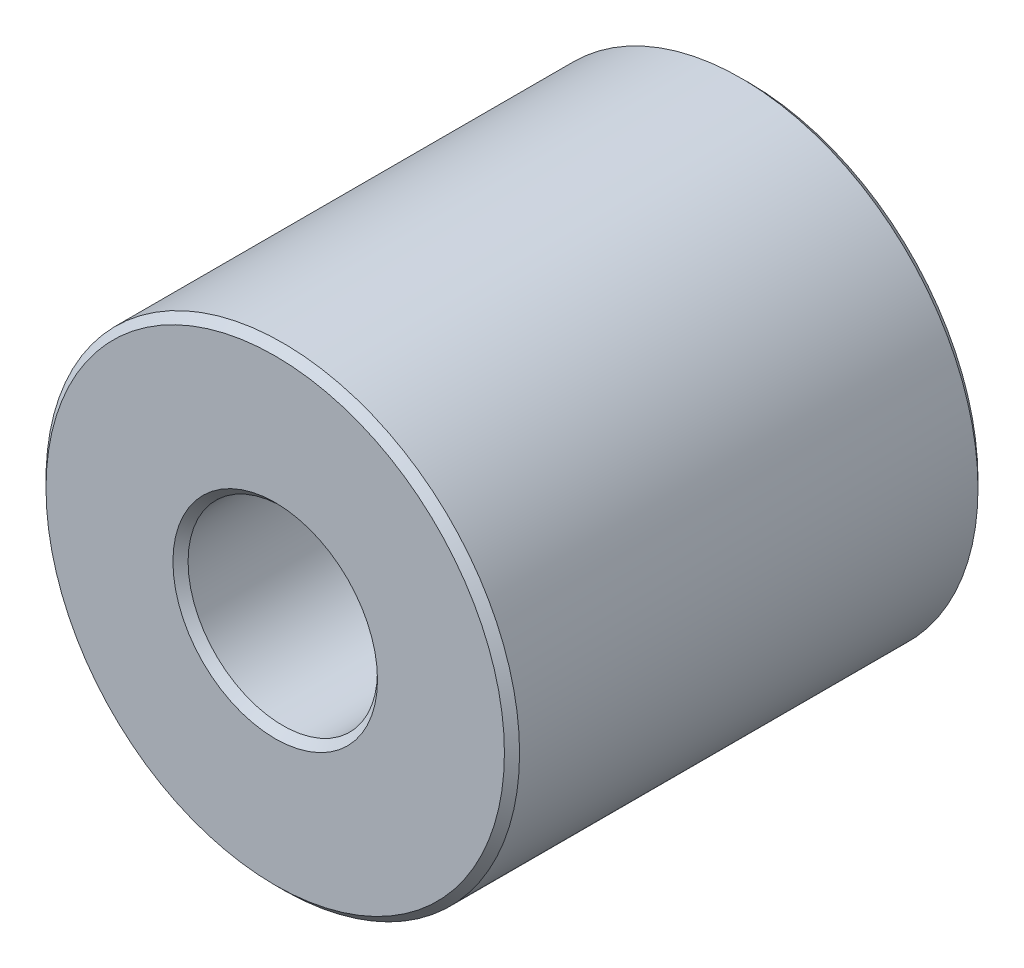
ISO-10303-21;
HEADER;
FILE_DESCRIPTION(('STEP AP214'),'2;1');
FILE_NAME('part.step','',(''),(''),'','','');
FILE_SCHEMA(('AUTOMOTIVE_DESIGN { 1 0 10303 214 1 1 1 1 }'));
ENDSEC;
DATA;
#1=APPLICATION_CONTEXT('core data for automotive mechanical design processes');
#2=APPLICATION_PROTOCOL_DEFINITION('international standard','automotive_design',2000,#1);
#3=PRODUCT_CONTEXT('',#1,'mechanical');
#4=PRODUCT('Part','Part','',(#3));
#5=PRODUCT_RELATED_PRODUCT_CATEGORY('part','',(#4));
#6=PRODUCT_DEFINITION_FORMATION('','',#4);
#7=PRODUCT_DEFINITION_CONTEXT('part definition',#1,'design');
#8=PRODUCT_DEFINITION('design','',#6,#7);
#9=PRODUCT_DEFINITION_SHAPE('','',#8);
#10=(LENGTH_UNIT() NAMED_UNIT(*) SI_UNIT(.MILLI.,.METRE.));
#11=(NAMED_UNIT(*) PLANE_ANGLE_UNIT() SI_UNIT($,.RADIAN.));
#12=(NAMED_UNIT(*) SI_UNIT($,.STERADIAN.) SOLID_ANGLE_UNIT());
#13=UNCERTAINTY_MEASURE_WITH_UNIT(LENGTH_MEASURE(1.E-05),#10,'distance_accuracy_value','');
#14=(GEOMETRIC_REPRESENTATION_CONTEXT(3) GLOBAL_UNCERTAINTY_ASSIGNED_CONTEXT((#13)) GLOBAL_UNIT_ASSIGNED_CONTEXT((#10,
#11,#12)) REPRESENTATION_CONTEXT('',''));
#15=CARTESIAN_POINT('',(0.,0.,0.));
#16=DIRECTION('',(0.,0.,1.));
#17=DIRECTION('',(1.,0.,0.));
#18=AXIS2_PLACEMENT_3D('',#15,#16,#17);
#19=CARTESIAN_POINT('',(0.,0.,15.875));
#20=DIRECTION('',(0.,0.,1.));
#21=DIRECTION('',(1.,0.,0.));
#22=AXIS2_PLACEMENT_3D('',#19,#20,#21);
#23=PLANE('',#22);
#24=CARTESIAN_POINT('',(0.,0.,15.875));
#25=DIRECTION('',(0.,0.,1.));
#26=DIRECTION('',(1.,0.,0.));
#27=AXIS2_PLACEMENT_3D('',#24,#25,#26);
#28=CIRCLE('',#27,7.6835);
#29=CARTESIAN_POINT('',(7.6835,0.,15.875));
#30=VERTEX_POINT('',#29);
#31=EDGE_CURVE('E10',#30,#30,#28,.T.);
#32=ORIENTED_EDGE('',*,*,#31,.T.);
#33=EDGE_LOOP('',(#32));
#34=FACE_BOUND('',#33,.T.);
#35=CARTESIAN_POINT('',(0.,0.,15.875));
#36=DIRECTION('',(0.,0.,1.));
#37=DIRECTION('',(1.,0.,0.));
#38=AXIS2_PLACEMENT_3D('',#35,#36,#37);
#39=CIRCLE('',#38,3.429);
#40=CARTESIAN_POINT('',(3.429,0.,15.875));
#41=VERTEX_POINT('',#40);
#42=EDGE_CURVE('E38',#41,#41,#39,.F.);
#43=ORIENTED_EDGE('',*,*,#42,.T.);
#44=EDGE_LOOP('',(#43));
#45=FACE_BOUND('',#44,.T.);
#46=ADVANCED_FACE('F31',(#34,#45),#23,.T.);
#47=CARTESIAN_POINT('',(0.,0.,0.));
#48=DIRECTION('',(0.,0.,1.));
#49=DIRECTION('',(1.,0.,0.));
#50=AXIS2_PLACEMENT_3D('',#47,#48,#49);
#51=PLANE('',#50);
#52=CARTESIAN_POINT('',(0.,0.,0.));
#53=DIRECTION('',(0.,0.,1.));
#54=DIRECTION('',(1.,0.,0.));
#55=AXIS2_PLACEMENT_3D('',#52,#53,#54);
#56=CIRCLE('',#55,7.6835);
#57=CARTESIAN_POINT('',(7.6835,0.,0.));
#58=VERTEX_POINT('',#57);
#59=EDGE_CURVE('E51',#58,#58,#56,.F.);
#60=ORIENTED_EDGE('',*,*,#59,.T.);
#61=EDGE_LOOP('',(#60));
#62=FACE_BOUND('',#61,.T.);
#63=CARTESIAN_POINT('',(0.,0.,0.));
#64=DIRECTION('',(0.,0.,1.));
#65=DIRECTION('',(1.,0.,0.));
#66=AXIS2_PLACEMENT_3D('',#63,#64,#65);
#67=CIRCLE('',#66,3.429);
#68=CARTESIAN_POINT('',(3.429,0.,0.));
#69=VERTEX_POINT('',#68);
#70=EDGE_CURVE('E54',#69,#69,#67,.T.);
#71=ORIENTED_EDGE('',*,*,#70,.T.);
#72=EDGE_LOOP('',(#71));
#73=FACE_BOUND('',#72,.T.);
#74=ADVANCED_FACE('F79',(#62,#73),#51,.F.);
#75=CARTESIAN_POINT('',(0.,0.,15.875));
#76=DIRECTION('',(0.,0.,-1.));
#77=DIRECTION('',(-1.,0.,0.));
#78=AXIS2_PLACEMENT_3D('',#75,#76,#77);
#79=CYLINDRICAL_SURFACE('',#78,7.9375);
#80=CARTESIAN_POINT('',(0.,0.,0.254000000000001));
#81=DIRECTION('',(0.,0.,1.));
#82=DIRECTION('',(1.,0.,0.));
#83=AXIS2_PLACEMENT_3D('',#80,#81,#82);
#84=CIRCLE('',#83,7.9375);
#85=CARTESIAN_POINT('',(7.9375,0.,0.254000000000001));
#86=VERTEX_POINT('',#85);
#87=EDGE_CURVE('E57',#86,#86,#84,.T.);
#88=ORIENTED_EDGE('',*,*,#87,.T.);
#89=EDGE_LOOP('',(#88));
#90=FACE_BOUND('',#89,.T.);
#91=CARTESIAN_POINT('',(0.,0.,15.621));
#92=DIRECTION('',(0.,0.,1.));
#93=DIRECTION('',(1.,0.,0.));
#94=AXIS2_PLACEMENT_3D('',#91,#92,#93);
#95=CIRCLE('',#94,7.9375);
#96=CARTESIAN_POINT('',(7.9375,0.,15.621));
#97=VERTEX_POINT('',#96);
#98=EDGE_CURVE('E60',#97,#97,#95,.F.);
#99=ORIENTED_EDGE('',*,*,#98,.T.);
#100=EDGE_LOOP('',(#99));
#101=FACE_BOUND('',#100,.T.);
#102=ADVANCED_FACE('F64',(#90,#101),#79,.T.);
#103=CARTESIAN_POINT('',(0.,0.,15.875));
#104=DIRECTION('',(0.,0.,-1.));
#105=DIRECTION('',(-1.,0.,0.));
#106=AXIS2_PLACEMENT_3D('',#103,#104,#105);
#107=CYLINDRICAL_SURFACE('',#106,3.175);
#108=CARTESIAN_POINT('',(0.,0.,0.254000000000001));
#109=DIRECTION('',(0.,0.,1.));
#110=DIRECTION('',(1.,0.,0.));
#111=AXIS2_PLACEMENT_3D('',#108,#109,#110);
#112=CIRCLE('',#111,3.175);
#113=CARTESIAN_POINT('',(3.175,0.,0.254000000000001));
#114=VERTEX_POINT('',#113);
#115=EDGE_CURVE('E42',#114,#114,#112,.F.);
#116=ORIENTED_EDGE('',*,*,#115,.T.);
#117=EDGE_LOOP('',(#116));
#118=FACE_BOUND('',#117,.T.);
#119=CARTESIAN_POINT('',(0.,0.,15.621));
#120=DIRECTION('',(0.,0.,1.));
#121=DIRECTION('',(1.,0.,0.));
#122=AXIS2_PLACEMENT_3D('',#119,#120,#121);
#123=CIRCLE('',#122,3.175);
#124=CARTESIAN_POINT('',(3.175,0.,15.621));
#125=VERTEX_POINT('',#124);
#126=EDGE_CURVE('E46',#125,#125,#123,.T.);
#127=ORIENTED_EDGE('',*,*,#126,.T.);
#128=EDGE_LOOP('',(#127));
#129=FACE_BOUND('',#128,.T.);
#130=ADVANCED_FACE('F87',(#118,#129),#107,.F.);
#131=CARTESIAN_POINT('',(0.,0.,0.254000000000001));
#132=DIRECTION('',(0.,0.,1.));
#133=DIRECTION('',(1.,0.,0.));
#134=AXIS2_PLACEMENT_3D('',#131,#132,#133);
#135=CONICAL_SURFACE('',#134,7.9375,0.785398163397452);
#136=ORIENTED_EDGE('',*,*,#59,.F.);
#137=EDGE_LOOP('',(#136));
#138=FACE_BOUND('',#137,.T.);
#139=ORIENTED_EDGE('',*,*,#87,.F.);
#140=EDGE_LOOP('',(#139));
#141=FACE_BOUND('',#140,.T.);
#142=ADVANCED_FACE('F75',(#138,#141),#135,.T.);
#143=CARTESIAN_POINT('',(0.,0.,0.));
#144=DIRECTION('',(0.,0.,-1.));
#145=DIRECTION('',(-1.,0.,0.));
#146=AXIS2_PLACEMENT_3D('',#143,#144,#145);
#147=CONICAL_SURFACE('',#146,3.429,0.785398163397443);
#148=ORIENTED_EDGE('',*,*,#115,.F.);
#149=EDGE_LOOP('',(#148));
#150=FACE_BOUND('',#149,.T.);
#151=ORIENTED_EDGE('',*,*,#70,.F.);
#152=EDGE_LOOP('',(#151));
#153=FACE_BOUND('',#152,.T.);
#154=ADVANCED_FACE('F69',(#150,#153),#147,.F.);
#155=CARTESIAN_POINT('',(0.,0.,15.875));
#156=DIRECTION('',(0.,0.,-1.));
#157=DIRECTION('',(-1.,0.,0.));
#158=AXIS2_PLACEMENT_3D('',#155,#156,#157);
#159=CONICAL_SURFACE('',#158,7.6835,0.785398163397442);
#160=ORIENTED_EDGE('',*,*,#98,.F.);
#161=EDGE_LOOP('',(#160));
#162=FACE_BOUND('',#161,.T.);
#163=ORIENTED_EDGE('',*,*,#31,.F.);
#164=EDGE_LOOP('',(#163));
#165=FACE_BOUND('',#164,.T.);
#166=ADVANCED_FACE('F66',(#162,#165),#159,.T.);
#167=CARTESIAN_POINT('',(0.,0.,15.621));
#168=DIRECTION('',(0.,0.,1.));
#169=DIRECTION('',(1.,0.,0.));
#170=AXIS2_PLACEMENT_3D('',#167,#168,#169);
#171=CONICAL_SURFACE('',#170,3.175,0.785398163397443);
#172=ORIENTED_EDGE('',*,*,#42,.F.);
#173=EDGE_LOOP('',(#172));
#174=FACE_BOUND('',#173,.T.);
#175=ORIENTED_EDGE('',*,*,#126,.F.);
#176=EDGE_LOOP('',(#175));
#177=FACE_BOUND('',#176,.T.);
#178=ADVANCED_FACE('F33',(#174,#177),#171,.F.);
#179=CLOSED_SHELL('',(#46,#74,#102,#130,#142,#154,#166,#178));
#180=MANIFOLD_SOLID_BREP('B2',#179);
#181=ADVANCED_BREP_SHAPE_REPRESENTATION('',(#18,#180),#14);
#182=SHAPE_DEFINITION_REPRESENTATION(#9,#181);
ENDSEC;
END-ISO-10303-21;
